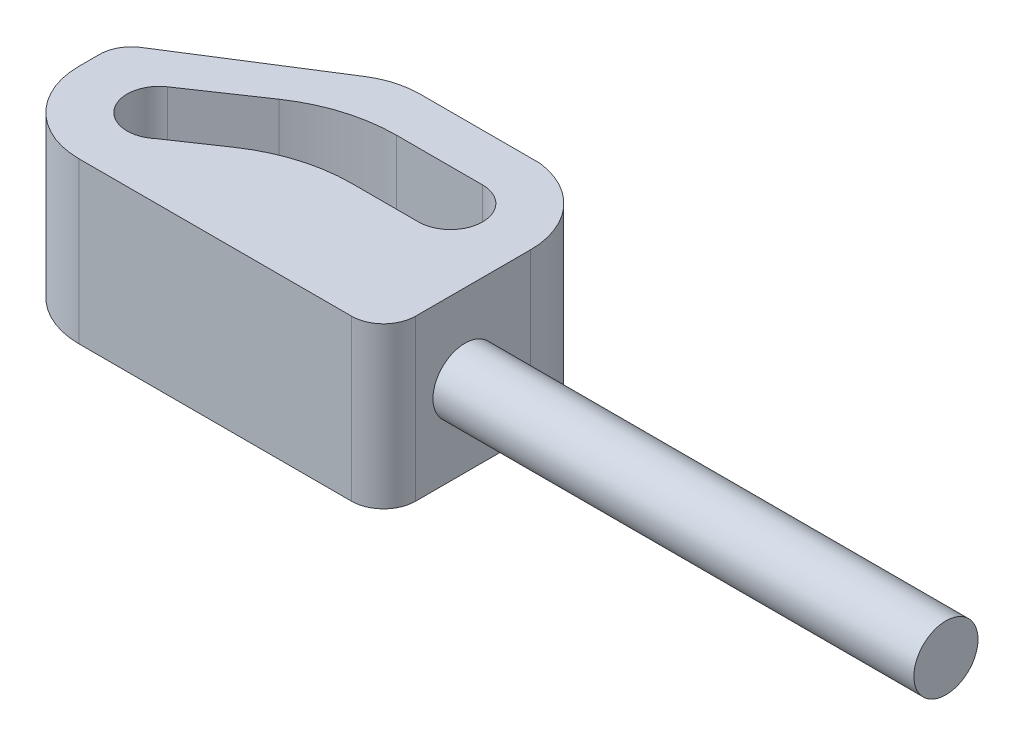
ISO-10303-21;
HEADER;
FILE_DESCRIPTION(('STEP AP214'),'2;1');
FILE_NAME('part.step','',(''),(''),'','','');
FILE_SCHEMA(('AUTOMOTIVE_DESIGN { 1 0 10303 214 1 1 1 1 }'));
ENDSEC;
DATA;
#1=APPLICATION_CONTEXT('core data for automotive mechanical design processes');
#2=APPLICATION_PROTOCOL_DEFINITION('international standard','automotive_design',2000,#1);
#3=PRODUCT_CONTEXT('',#1,'mechanical');
#4=PRODUCT('Part','Part','',(#3));
#5=PRODUCT_RELATED_PRODUCT_CATEGORY('part','',(#4));
#6=PRODUCT_DEFINITION_FORMATION('','',#4);
#7=PRODUCT_DEFINITION_CONTEXT('part definition',#1,'design');
#8=PRODUCT_DEFINITION('design','',#6,#7);
#9=PRODUCT_DEFINITION_SHAPE('','',#8);
#10=(LENGTH_UNIT() NAMED_UNIT(*) SI_UNIT(.MILLI.,.METRE.));
#11=(NAMED_UNIT(*) PLANE_ANGLE_UNIT() SI_UNIT($,.RADIAN.));
#12=(NAMED_UNIT(*) SI_UNIT($,.STERADIAN.) SOLID_ANGLE_UNIT());
#13=UNCERTAINTY_MEASURE_WITH_UNIT(LENGTH_MEASURE(1.E-05),#10,'distance_accuracy_value','');
#14=(GEOMETRIC_REPRESENTATION_CONTEXT(3) GLOBAL_UNCERTAINTY_ASSIGNED_CONTEXT((#13)) GLOBAL_UNIT_ASSIGNED_CONTEXT((#10,
#11,#12)) REPRESENTATION_CONTEXT('',''));
#15=CARTESIAN_POINT('',(0.,0.,0.));
#16=DIRECTION('',(0.,0.,1.));
#17=DIRECTION('',(1.,0.,0.));
#18=AXIS2_PLACEMENT_3D('',#15,#16,#17);
#19=CARTESIAN_POINT('',(14.084329858718,10.,7.91567014128203));
#20=DIRECTION('',(-1.,0.,0.));
#21=DIRECTION('',(0.,0.,1.));
#22=AXIS2_PLACEMENT_3D('',#19,#20,#21);
#23=PLANE('',#22);
#24=CARTESIAN_POINT('',(14.084329858718,5.,4.8338575747895));
#25=DIRECTION('',(-1.,0.,0.));
#26=DIRECTION('',(0.,0.,1.));
#27=AXIS2_PLACEMENT_3D('',#24,#25,#26);
#28=CIRCLE('',#27,2.);
#29=CARTESIAN_POINT('',(14.084329858718,5.,6.8338575747895));
#30=VERTEX_POINT('',#29);
#31=EDGE_CURVE('E12',#30,#30,#28,.F.);
#32=ORIENTED_EDGE('',*,*,#31,.F.);
#33=EDGE_LOOP('',(#32));
#34=FACE_BOUND('',#33,.T.);
#35=DIRECTION('',(0.,0.,-1.));
#36=VECTOR('',#35,1.);
#37=CARTESIAN_POINT('',(14.084329858718,0.,7.91567014128203));
#38=LINE('',#37,#36);
#39=CARTESIAN_POINT('',(14.084329858718,0.,7.91567014128203));
#40=VERTEX_POINT('',#39);
#41=CARTESIAN_POINT('',(14.084329858718,0.,0.738316599191666));
#42=VERTEX_POINT('',#41);
#43=EDGE_CURVE('E223',#40,#42,#38,.T.);
#44=ORIENTED_EDGE('',*,*,#43,.T.);
#45=DIRECTION('',(0.,-1.,0.));
#46=VECTOR('',#45,1.);
#47=CARTESIAN_POINT('',(14.084329858718,10.,0.738316599191666));
#48=LINE('',#47,#46);
#49=CARTESIAN_POINT('',(14.084329858718,10.,0.738316599191666));
#50=VERTEX_POINT('',#49);
#51=EDGE_CURVE('E97',#50,#42,#48,.T.);
#52=ORIENTED_EDGE('',*,*,#51,.F.);
#53=DIRECTION('',(0.,0.,-1.));
#54=VECTOR('',#53,1.);
#55=CARTESIAN_POINT('',(14.084329858718,10.,7.91567014128203));
#56=LINE('',#55,#54);
#57=CARTESIAN_POINT('',(14.084329858718,10.,7.91567014128203));
#58=VERTEX_POINT('',#57);
#59=EDGE_CURVE('E284',#58,#50,#56,.T.);
#60=ORIENTED_EDGE('',*,*,#59,.F.);
#61=DIRECTION('',(0.,-1.,0.));
#62=VECTOR('',#61,1.);
#63=CARTESIAN_POINT('',(14.084329858718,10.,7.91567014128203));
#64=LINE('',#63,#62);
#65=EDGE_CURVE('E307',#58,#40,#64,.T.);
#66=ORIENTED_EDGE('',*,*,#65,.T.);
#67=EDGE_LOOP('',(#44,#52,#60,#66));
#68=FACE_BOUND('',#67,.T.);
#69=ADVANCED_FACE('F90',(#34,#68),#23,.F.);
#70=CARTESIAN_POINT('',(9.08432985871795,10.,0.738316599191666));
#71=DIRECTION('',(0.,-1.,0.));
#72=DIRECTION('',(0.,0.,-1.));
#73=AXIS2_PLACEMENT_3D('',#70,#71,#72);
#74=CYLINDRICAL_SURFACE('',#73,5.);
#75=CARTESIAN_POINT('',(9.08432985871795,0.,0.738316599191666));
#76=DIRECTION('',(0.,1.,0.));
#77=DIRECTION('',(0.,0.,1.));
#78=AXIS2_PLACEMENT_3D('',#75,#76,#77);
#79=CIRCLE('',#78,5.);
#80=CARTESIAN_POINT('',(9.73028422272676,0.,-4.21978212507936));
#81=VERTEX_POINT('',#80);
#82=EDGE_CURVE('E310',#42,#81,#79,.T.);
#83=ORIENTED_EDGE('',*,*,#82,.T.);
#84=DIRECTION('',(0.,-1.,0.));
#85=VECTOR('',#84,1.);
#86=CARTESIAN_POINT('',(9.73028422272676,10.,-4.21978212507936));
#87=LINE('',#86,#85);
#88=CARTESIAN_POINT('',(9.73028422272676,10.,-4.21978212507936));
#89=VERTEX_POINT('',#88);
#90=EDGE_CURVE('E350',#89,#81,#87,.T.);
#91=ORIENTED_EDGE('',*,*,#90,.F.);
#92=CARTESIAN_POINT('',(9.08432985871795,10.,0.738316599191666));
#93=DIRECTION('',(0.,1.,0.));
#94=DIRECTION('',(0.,0.,1.));
#95=AXIS2_PLACEMENT_3D('',#92,#93,#94);
#96=CIRCLE('',#95,5.);
#97=EDGE_CURVE('E287',#50,#89,#96,.T.);
#98=ORIENTED_EDGE('',*,*,#97,.F.);
#99=ORIENTED_EDGE('',*,*,#51,.T.);
#100=EDGE_LOOP('',(#83,#91,#98,#99));
#101=FACE_BOUND('',#100,.T.);
#102=ADVANCED_FACE('F355',(#101),#74,.T.);
#103=CARTESIAN_POINT('',(9.73028422272676,10.,-4.21978212507936));
#104=DIRECTION('',(0.,0.,1.));
#105=DIRECTION('',(1.,0.,0.));
#106=AXIS2_PLACEMENT_3D('',#103,#104,#105);
#107=PLANE('',#106);
#108=DIRECTION('',(-1.,0.,0.));
#109=VECTOR('',#108,1.);
#110=CARTESIAN_POINT('',(9.73028422272676,0.,-4.21978212507936));
#111=LINE('',#110,#109);
#112=CARTESIAN_POINT('',(2.22436047137036,0.,-4.21978212507936));
#113=VERTEX_POINT('',#112);
#114=EDGE_CURVE('E312',#81,#113,#111,.T.);
#115=ORIENTED_EDGE('',*,*,#114,.T.);
#116=DIRECTION('',(0.,-1.,0.));
#117=VECTOR('',#116,1.);
#118=CARTESIAN_POINT('',(2.22436047137036,10.,-4.21978212507936));
#119=LINE('',#118,#117);
#120=CARTESIAN_POINT('',(2.22436047137036,10.,-4.21978212507936));
#121=VERTEX_POINT('',#120);
#122=EDGE_CURVE('E347',#121,#113,#119,.T.);
#123=ORIENTED_EDGE('',*,*,#122,.F.);
#124=DIRECTION('',(-1.,0.,0.));
#125=VECTOR('',#124,1.);
#126=CARTESIAN_POINT('',(9.73028422272676,10.,-4.21978212507936));
#127=LINE('',#126,#125);
#128=EDGE_CURVE('E290',#89,#121,#127,.T.);
#129=ORIENTED_EDGE('',*,*,#128,.F.);
#130=ORIENTED_EDGE('',*,*,#90,.T.);
#131=EDGE_LOOP('',(#115,#123,#129,#130));
#132=FACE_BOUND('',#131,.T.);
#133=ADVANCED_FACE('F370',(#132),#107,.F.);
#134=CARTESIAN_POINT('',(2.22436047137034,10.,0.780217874920642));
#135=DIRECTION('',(0.,-1.,0.));
#136=DIRECTION('',(0.,0.,-1.));
#137=AXIS2_PLACEMENT_3D('',#134,#135,#136);
#138=CYLINDRICAL_SURFACE('',#137,5.);
#139=CARTESIAN_POINT('',(2.22436047137034,0.,0.780217874920642));
#140=DIRECTION('',(0.,1.,0.));
#141=DIRECTION('',(0.,0.,1.));
#142=AXIS2_PLACEMENT_3D('',#139,#140,#141);
#143=CIRCLE('',#142,5.);
#144=CARTESIAN_POINT('',(-0.4483472573236,0.,-3.44549311815256));
#145=VERTEX_POINT('',#144);
#146=EDGE_CURVE('E314',#113,#145,#143,.T.);
#147=ORIENTED_EDGE('',*,*,#146,.T.);
#148=DIRECTION('',(0.,-1.,0.));
#149=VECTOR('',#148,1.);
#150=CARTESIAN_POINT('',(-0.4483472573236,10.,-3.44549311815256));
#151=LINE('',#150,#149);
#152=CARTESIAN_POINT('',(-0.4483472573236,10.,-3.44549311815256));
#153=VERTEX_POINT('',#152);
#154=EDGE_CURVE('E344',#153,#145,#151,.T.);
#155=ORIENTED_EDGE('',*,*,#154,.F.);
#156=CARTESIAN_POINT('',(2.22436047137034,10.,0.780217874920642));
#157=DIRECTION('',(0.,1.,0.));
#158=DIRECTION('',(0.,0.,1.));
#159=AXIS2_PLACEMENT_3D('',#156,#157,#158);
#160=CIRCLE('',#159,5.);
#161=EDGE_CURVE('E292',#121,#153,#160,.T.);
#162=ORIENTED_EDGE('',*,*,#161,.F.);
#163=ORIENTED_EDGE('',*,*,#122,.T.);
#164=EDGE_LOOP('',(#147,#155,#162,#163));
#165=FACE_BOUND('',#164,.T.);
#166=ADVANCED_FACE('F374',(#165),#138,.T.);
#167=CARTESIAN_POINT('',(-0.448347257323602,10.,-3.44549311815255));
#168=DIRECTION('',(0.534541545738786,0.,0.845142198614641));
#169=DIRECTION('',(0.845142198614641,0.,-0.534541545738786));
#170=AXIS2_PLACEMENT_3D('',#167,#168,#169);
#171=PLANE('',#170);
#172=DIRECTION('',(-0.845142198614641,0.,0.534541545738786));
#173=VECTOR('',#172,1.);
#174=CARTESIAN_POINT('',(-0.448347257323602,0.,-3.44549311815255));
#175=LINE('',#174,#173);
#176=CARTESIAN_POINT('',(-8.98475323275961,0.,1.95367361691659));
#177=VERTEX_POINT('',#176);
#178=EDGE_CURVE('E316',#145,#177,#175,.T.);
#179=ORIENTED_EDGE('',*,*,#178,.T.);
#180=DIRECTION('',(0.,-1.,0.));
#181=VECTOR('',#180,1.);
#182=CARTESIAN_POINT('',(-8.98475323275961,10.,1.95367361691659));
#183=LINE('',#182,#181);
#184=CARTESIAN_POINT('',(-8.98475323275961,10.,1.95367361691659));
#185=VERTEX_POINT('',#184);
#186=EDGE_CURVE('E341',#185,#177,#183,.T.);
#187=ORIENTED_EDGE('',*,*,#186,.F.);
#188=DIRECTION('',(-0.845142198614641,0.,0.534541545738786));
#189=VECTOR('',#188,1.);
#190=CARTESIAN_POINT('',(-0.448347257323602,10.,-3.44549311815255));
#191=LINE('',#190,#189);
#192=EDGE_CURVE('E294',#153,#185,#191,.T.);
#193=ORIENTED_EDGE('',*,*,#192,.F.);
#194=ORIENTED_EDGE('',*,*,#154,.T.);
#195=EDGE_LOOP('',(#179,#187,#193,#194));
#196=FACE_BOUND('',#195,.T.);
#197=ADVANCED_FACE('F399',(#196),#171,.F.);
#198=CARTESIAN_POINT('',(-7.91567014128205,10.,3.64395801414588));
#199=DIRECTION('',(0.,-1.,0.));
#200=DIRECTION('',(0.,0.,-1.));
#201=AXIS2_PLACEMENT_3D('',#198,#199,#200);
#202=CYLINDRICAL_SURFACE('',#201,2.);
#203=CARTESIAN_POINT('',(-7.91567014128205,0.,3.64395801414588));
#204=DIRECTION('',(0.,1.,0.));
#205=DIRECTION('',(0.,0.,1.));
#206=AXIS2_PLACEMENT_3D('',#203,#204,#205);
#207=CIRCLE('',#206,2.);
#208=CARTESIAN_POINT('',(-9.91567014128204,0.,3.64395801414588));
#209=VERTEX_POINT('',#208);
#210=EDGE_CURVE('E318',#177,#209,#207,.T.);
#211=ORIENTED_EDGE('',*,*,#210,.T.);
#212=DIRECTION('',(0.,-1.,0.));
#213=VECTOR('',#212,1.);
#214=CARTESIAN_POINT('',(-9.91567014128204,10.,3.64395801414588));
#215=LINE('',#214,#213);
#216=CARTESIAN_POINT('',(-9.91567014128204,10.,3.64395801414588));
#217=VERTEX_POINT('',#216);
#218=EDGE_CURVE('E339',#217,#209,#215,.T.);
#219=ORIENTED_EDGE('',*,*,#218,.F.);
#220=CARTESIAN_POINT('',(-7.91567014128205,10.,3.64395801414588));
#221=DIRECTION('',(0.,1.,0.));
#222=DIRECTION('',(0.,0.,1.));
#223=AXIS2_PLACEMENT_3D('',#220,#221,#222);
#224=CIRCLE('',#223,2.);
#225=EDGE_CURVE('E296',#185,#217,#224,.T.);
#226=ORIENTED_EDGE('',*,*,#225,.F.);
#227=ORIENTED_EDGE('',*,*,#186,.T.);
#228=EDGE_LOOP('',(#211,#219,#226,#227));
#229=FACE_BOUND('',#228,.T.);
#230=ADVANCED_FACE('F397',(#229),#202,.T.);
#231=CARTESIAN_POINT('',(-9.91567014128205,10.,4.91567014128205));
#232=DIRECTION('',(-1.,0.,0.));
#233=DIRECTION('',(0.,0.,1.));
#234=AXIS2_PLACEMENT_3D('',#231,#232,#233);
#235=PLANE('',#234);
#236=DIRECTION('',(0.,0.,-1.));
#237=VECTOR('',#236,1.);
#238=CARTESIAN_POINT('',(-9.91567014128205,0.,4.91567014128205));
#239=LINE('',#238,#237);
#240=CARTESIAN_POINT('',(-9.91567014128205,0.,4.91567014128205));
#241=VERTEX_POINT('',#240);
#242=EDGE_CURVE('E321',#241,#209,#239,.T.);
#243=ORIENTED_EDGE('',*,*,#242,.F.);
#244=DIRECTION('',(0.,-1.,0.));
#245=VECTOR('',#244,1.);
#246=CARTESIAN_POINT('',(-9.91567014128205,10.,4.91567014128205));
#247=LINE('',#246,#245);
#248=CARTESIAN_POINT('',(-9.91567014128205,10.,4.91567014128205));
#249=VERTEX_POINT('',#248);
#250=EDGE_CURVE('E337',#249,#241,#247,.T.);
#251=ORIENTED_EDGE('',*,*,#250,.F.);
#252=DIRECTION('',(0.,0.,-1.));
#253=VECTOR('',#252,1.);
#254=CARTESIAN_POINT('',(-9.91567014128205,10.,4.91567014128205));
#255=LINE('',#254,#253);
#256=EDGE_CURVE('E298',#249,#217,#255,.T.);
#257=ORIENTED_EDGE('',*,*,#256,.T.);
#258=ORIENTED_EDGE('',*,*,#218,.T.);
#259=EDGE_LOOP('',(#243,#251,#257,#258));
#260=FACE_BOUND('',#259,.T.);
#261=ADVANCED_FACE('F391',(#260),#235,.T.);
#262=CARTESIAN_POINT('',(-4.91567014128205,10.,4.91567014128205));
#263=DIRECTION('',(0.,-1.,0.));
#264=DIRECTION('',(0.,0.,-1.));
#265=AXIS2_PLACEMENT_3D('',#262,#263,#264);
#266=CYLINDRICAL_SURFACE('',#265,5.);
#267=CARTESIAN_POINT('',(-4.91567014128205,0.,4.91567014128205));
#268=DIRECTION('',(0.,1.,0.));
#269=DIRECTION('',(0.,0.,1.));
#270=AXIS2_PLACEMENT_3D('',#267,#268,#269);
#271=CIRCLE('',#270,5.);
#272=CARTESIAN_POINT('',(-4.91567014128205,0.,9.91567014128205));
#273=VERTEX_POINT('',#272);
#274=EDGE_CURVE('E324',#241,#273,#271,.T.);
#275=ORIENTED_EDGE('',*,*,#274,.T.);
#276=DIRECTION('',(0.,-1.,0.));
#277=VECTOR('',#276,1.);
#278=CARTESIAN_POINT('',(-4.91567014128205,10.,9.91567014128205));
#279=LINE('',#278,#277);
#280=CARTESIAN_POINT('',(-4.91567014128205,10.,9.91567014128205));
#281=VERTEX_POINT('',#280);
#282=EDGE_CURVE('E334',#281,#273,#279,.T.);
#283=ORIENTED_EDGE('',*,*,#282,.F.);
#284=CARTESIAN_POINT('',(-4.91567014128205,10.,4.91567014128205));
#285=DIRECTION('',(0.,1.,0.));
#286=DIRECTION('',(0.,0.,1.));
#287=AXIS2_PLACEMENT_3D('',#284,#285,#286);
#288=CIRCLE('',#287,5.);
#289=EDGE_CURVE('E301',#249,#281,#288,.T.);
#290=ORIENTED_EDGE('',*,*,#289,.F.);
#291=ORIENTED_EDGE('',*,*,#250,.T.);
#292=EDGE_LOOP('',(#275,#283,#290,#291));
#293=FACE_BOUND('',#292,.T.);
#294=ADVANCED_FACE('F400',(#293),#266,.T.);
#295=CARTESIAN_POINT('',(-4.91567014128205,10.,9.91567014128205));
#296=DIRECTION('',(0.,0.,-1.));
#297=DIRECTION('',(-1.,0.,0.));
#298=AXIS2_PLACEMENT_3D('',#295,#296,#297);
#299=PLANE('',#298);
#300=DIRECTION('',(1.,0.,0.));
#301=VECTOR('',#300,1.);
#302=CARTESIAN_POINT('',(-4.91567014128205,0.,9.91567014128205));
#303=LINE('',#302,#301);
#304=CARTESIAN_POINT('',(12.0843298587179,0.,9.91567014128205));
#305=VERTEX_POINT('',#304);
#306=EDGE_CURVE('E326',#273,#305,#303,.T.);
#307=ORIENTED_EDGE('',*,*,#306,.T.);
#308=DIRECTION('',(0.,-1.,0.));
#309=VECTOR('',#308,1.);
#310=CARTESIAN_POINT('',(12.0843298587179,10.,9.91567014128205));
#311=LINE('',#310,#309);
#312=CARTESIAN_POINT('',(12.0843298587179,10.,9.91567014128205));
#313=VERTEX_POINT('',#312);
#314=EDGE_CURVE('E331',#313,#305,#311,.T.);
#315=ORIENTED_EDGE('',*,*,#314,.F.);
#316=DIRECTION('',(1.,0.,0.));
#317=VECTOR('',#316,1.);
#318=CARTESIAN_POINT('',(-4.91567014128205,10.,9.91567014128205));
#319=LINE('',#318,#317);
#320=EDGE_CURVE('E303',#281,#313,#319,.T.);
#321=ORIENTED_EDGE('',*,*,#320,.F.);
#322=ORIENTED_EDGE('',*,*,#282,.T.);
#323=EDGE_LOOP('',(#307,#315,#321,#322));
#324=FACE_BOUND('',#323,.T.);
#325=ADVANCED_FACE('F384',(#324),#299,.F.);
#326=CARTESIAN_POINT('',(12.084329858718,10.,7.91567014128205));
#327=DIRECTION('',(0.,-1.,0.));
#328=DIRECTION('',(0.,0.,-1.));
#329=AXIS2_PLACEMENT_3D('',#326,#327,#328);
#330=CYLINDRICAL_SURFACE('',#329,2.);
#331=CARTESIAN_POINT('',(12.084329858718,0.,7.91567014128205));
#332=DIRECTION('',(0.,1.,0.));
#333=DIRECTION('',(0.,0.,1.));
#334=AXIS2_PLACEMENT_3D('',#331,#332,#333);
#335=CIRCLE('',#334,2.);
#336=EDGE_CURVE('E288',#305,#40,#335,.T.);
#337=ORIENTED_EDGE('',*,*,#336,.T.);
#338=ORIENTED_EDGE('',*,*,#65,.F.);
#339=CARTESIAN_POINT('',(12.084329858718,10.,7.91567014128205));
#340=DIRECTION('',(0.,1.,0.));
#341=DIRECTION('',(0.,0.,1.));
#342=AXIS2_PLACEMENT_3D('',#339,#340,#341);
#343=CIRCLE('',#342,2.);
#344=EDGE_CURVE('E305',#313,#58,#343,.T.);
#345=ORIENTED_EDGE('',*,*,#344,.F.);
#346=ORIENTED_EDGE('',*,*,#314,.T.);
#347=EDGE_LOOP('',(#337,#338,#345,#346));
#348=FACE_BOUND('',#347,.T.);
#349=ADVANCED_FACE('F382',(#348),#330,.T.);
#350=CARTESIAN_POINT('',(9.08432985871795,10.,0.738316599191666));
#351=DIRECTION('',(0.,1.,0.));
#352=DIRECTION('',(0.,0.,1.));
#353=AXIS2_PLACEMENT_3D('',#350,#351,#352);
#354=PLANE('',#353);
#355=CARTESIAN_POINT('',(3.70785032675634,10.,8.73831659919167));
#356=DIRECTION('',(0.,1.,0.));
#357=DIRECTION('',(0.,0.,1.));
#358=AXIS2_PLACEMENT_3D('',#355,#356,#357);
#359=CIRCLE('',#358,10.);
#360=CARTESIAN_POINT('',(-1.89843399280002,10.,0.457641739719377));
#361=VERTEX_POINT('',#360);
#362=CARTESIAN_POINT('',(3.70785032675634,10.,-1.26168340080833));
#363=VERTEX_POINT('',#362);
#364=EDGE_CURVE('E227',#361,#363,#359,.F.);
#365=ORIENTED_EDGE('',*,*,#364,.T.);
#366=DIRECTION('',(-1.,0.,0.));
#367=VECTOR('',#366,1.);
#368=CARTESIAN_POINT('',(0.,10.,-1.26168340080833));
#369=LINE('',#368,#367);
#370=CARTESIAN_POINT('',(9.08432985871795,10.,-1.26168340080833));
#371=VERTEX_POINT('',#370);
#372=EDGE_CURVE('E251',#371,#363,#369,.T.);
#373=ORIENTED_EDGE('',*,*,#372,.F.);
#374=CARTESIAN_POINT('',(9.08432985871795,10.,0.738316599191666));
#375=DIRECTION('',(0.,1.,0.));
#376=DIRECTION('',(0.,0.,1.));
#377=AXIS2_PLACEMENT_3D('',#374,#375,#376);
#378=CIRCLE('',#377,2.);
#379=CARTESIAN_POINT('',(9.08432985871795,10.,2.73831659919167));
#380=VERTEX_POINT('',#379);
#381=EDGE_CURVE('E249',#380,#371,#378,.T.);
#382=ORIENTED_EDGE('',*,*,#381,.F.);
#383=DIRECTION('',(-1.,0.,0.));
#384=VECTOR('',#383,1.);
#385=CARTESIAN_POINT('',(0.,10.,2.73831659919167));
#386=LINE('',#385,#384);
#387=CARTESIAN_POINT('',(4.90888820113521,10.,2.73831659919167));
#388=VERTEX_POINT('',#387);
#389=EDGE_CURVE('E246',#380,#388,#386,.T.);
#390=ORIENTED_EDGE('',*,*,#389,.T.);
#391=CARTESIAN_POINT('',(4.90888820113521,10.,12.7383165991917));
#392=DIRECTION('',(0.,1.,0.));
#393=DIRECTION('',(0.,0.,1.));
#394=AXIS2_PLACEMENT_3D('',#391,#392,#393);
#395=CIRCLE('',#394,10.);
#396=CARTESIAN_POINT('',(-0.697396118421155,10.,4.45764173971938));
#397=VERTEX_POINT('',#396);
#398=EDGE_CURVE('E244',#397,#388,#395,.F.);
#399=ORIENTED_EDGE('',*,*,#398,.F.);
#400=DIRECTION('',(-0.828067485947229,0.,0.560628431955636));
#401=VECTOR('',#400,1.);
#402=CARTESIAN_POINT('',(1.85021291531593,10.,2.73282814413877));
#403=LINE('',#402,#401);
#404=CARTESIAN_POINT('',(-3.60414551890359,10.,6.42560496268827));
#405=VERTEX_POINT('',#404);
#406=EDGE_CURVE('E239',#397,#405,#403,.T.);
#407=ORIENTED_EDGE('',*,*,#406,.T.);
#408=CARTESIAN_POINT('',(-4.91567014128205,10.,4.91567014128205));
#409=DIRECTION('',(0.,1.,0.));
#410=DIRECTION('',(0.,0.,1.));
#411=AXIS2_PLACEMENT_3D('',#408,#409,#410);
#412=CIRCLE('',#411,2.);
#413=CARTESIAN_POINT('',(-6.03692700519332,10.,3.25953516938759));
#414=VERTEX_POINT('',#413);
#415=EDGE_CURVE('E237',#414,#405,#412,.T.);
#416=ORIENTED_EDGE('',*,*,#415,.F.);
#417=DIRECTION('',(0.828067485947229,0.,-0.560628431955637));
#418=VECTOR('',#417,1.);
#419=CARTESIAN_POINT('',(-0.384231084261217,10.,-0.567522533341906));
#420=LINE('',#419,#418);
#421=EDGE_CURVE('E219',#414,#361,#420,.T.);
#422=ORIENTED_EDGE('',*,*,#421,.T.);
#423=EDGE_LOOP('',(#365,#373,#382,#390,#399,#407,#416,#422));
#424=FACE_BOUND('',#423,.T.);
#425=ORIENTED_EDGE('',*,*,#59,.T.);
#426=ORIENTED_EDGE('',*,*,#97,.T.);
#427=ORIENTED_EDGE('',*,*,#128,.T.);
#428=ORIENTED_EDGE('',*,*,#161,.T.);
#429=ORIENTED_EDGE('',*,*,#192,.T.);
#430=ORIENTED_EDGE('',*,*,#225,.T.);
#431=ORIENTED_EDGE('',*,*,#256,.F.);
#432=ORIENTED_EDGE('',*,*,#289,.T.);
#433=ORIENTED_EDGE('',*,*,#320,.T.);
#434=ORIENTED_EDGE('',*,*,#344,.T.);
#435=EDGE_LOOP('',(#425,#426,#427,#428,#429,#430,#431,#432,#433,#434));
#436=FACE_BOUND('',#435,.T.);
#437=ADVANCED_FACE('F234',(#424,#436),#354,.T.);
#438=CARTESIAN_POINT('',(9.08432985871795,0.,0.738316599191666));
#439=DIRECTION('',(0.,1.,0.));
#440=DIRECTION('',(0.,0.,1.));
#441=AXIS2_PLACEMENT_3D('',#438,#439,#440);
#442=PLANE('',#441);
#443=DIRECTION('',(-1.,0.,0.));
#444=VECTOR('',#443,1.);
#445=CARTESIAN_POINT('',(0.,0.,-1.26168340080833));
#446=LINE('',#445,#444);
#447=CARTESIAN_POINT('',(9.08432985871795,0.,-1.26168340080833));
#448=VERTEX_POINT('',#447);
#449=CARTESIAN_POINT('',(3.70785032675634,0.,-1.26168340080833));
#450=VERTEX_POINT('',#449);
#451=EDGE_CURVE('E232',#448,#450,#446,.T.);
#452=ORIENTED_EDGE('',*,*,#451,.T.);
#453=CARTESIAN_POINT('',(3.70785032675634,0.,8.73831659919167));
#454=DIRECTION('',(0.,1.,0.));
#455=DIRECTION('',(0.,0.,1.));
#456=AXIS2_PLACEMENT_3D('',#453,#454,#455);
#457=CIRCLE('',#456,10.);
#458=CARTESIAN_POINT('',(-1.89843399280002,0.,0.457641739719377));
#459=VERTEX_POINT('',#458);
#460=EDGE_CURVE('E112',#459,#450,#457,.F.);
#461=ORIENTED_EDGE('',*,*,#460,.F.);
#462=DIRECTION('',(0.828067485947229,0.,-0.560628431955637));
#463=VECTOR('',#462,1.);
#464=CARTESIAN_POINT('',(-0.384231084261217,0.,-0.567522533341906));
#465=LINE('',#464,#463);
#466=CARTESIAN_POINT('',(-6.03692700519332,0.,3.25953516938759));
#467=VERTEX_POINT('',#466);
#468=EDGE_CURVE('E222',#467,#459,#465,.T.);
#469=ORIENTED_EDGE('',*,*,#468,.F.);
#470=CARTESIAN_POINT('',(-4.91567014128205,0.,4.91567014128205));
#471=DIRECTION('',(0.,1.,0.));
#472=DIRECTION('',(0.,0.,1.));
#473=AXIS2_PLACEMENT_3D('',#470,#471,#472);
#474=CIRCLE('',#473,2.);
#475=CARTESIAN_POINT('',(-3.60414551890359,0.,6.42560496268827));
#476=VERTEX_POINT('',#475);
#477=EDGE_CURVE('E256',#467,#476,#474,.T.);
#478=ORIENTED_EDGE('',*,*,#477,.T.);
#479=DIRECTION('',(-0.828067485947229,0.,0.560628431955636));
#480=VECTOR('',#479,1.);
#481=CARTESIAN_POINT('',(1.85021291531593,0.,2.73282814413877));
#482=LINE('',#481,#480);
#483=CARTESIAN_POINT('',(-0.697396118421155,0.,4.45764173971938));
#484=VERTEX_POINT('',#483);
#485=EDGE_CURVE('E259',#484,#476,#482,.T.);
#486=ORIENTED_EDGE('',*,*,#485,.F.);
#487=CARTESIAN_POINT('',(4.90888820113521,0.,12.7383165991917));
#488=DIRECTION('',(0.,1.,0.));
#489=DIRECTION('',(0.,0.,1.));
#490=AXIS2_PLACEMENT_3D('',#487,#488,#489);
#491=CIRCLE('',#490,10.);
#492=CARTESIAN_POINT('',(4.90888820113521,0.,2.73831659919167));
#493=VERTEX_POINT('',#492);
#494=EDGE_CURVE('E262',#484,#493,#491,.F.);
#495=ORIENTED_EDGE('',*,*,#494,.T.);
#496=DIRECTION('',(-1.,0.,0.));
#497=VECTOR('',#496,1.);
#498=CARTESIAN_POINT('',(0.,0.,2.73831659919167));
#499=LINE('',#498,#497);
#500=CARTESIAN_POINT('',(9.08432985871795,0.,2.73831659919167));
#501=VERTEX_POINT('',#500);
#502=EDGE_CURVE('E265',#501,#493,#499,.T.);
#503=ORIENTED_EDGE('',*,*,#502,.F.);
#504=CARTESIAN_POINT('',(9.08432985871795,0.,0.738316599191666));
#505=DIRECTION('',(0.,1.,0.));
#506=DIRECTION('',(0.,0.,1.));
#507=AXIS2_PLACEMENT_3D('',#504,#505,#506);
#508=CIRCLE('',#507,2.);
#509=EDGE_CURVE('E268',#501,#448,#508,.T.);
#510=ORIENTED_EDGE('',*,*,#509,.T.);
#511=EDGE_LOOP('',(#452,#461,#469,#478,#486,#495,#503,#510));
#512=FACE_BOUND('',#511,.T.);
#513=ORIENTED_EDGE('',*,*,#43,.F.);
#514=ORIENTED_EDGE('',*,*,#336,.F.);
#515=ORIENTED_EDGE('',*,*,#306,.F.);
#516=ORIENTED_EDGE('',*,*,#274,.F.);
#517=ORIENTED_EDGE('',*,*,#242,.T.);
#518=ORIENTED_EDGE('',*,*,#210,.F.);
#519=ORIENTED_EDGE('',*,*,#178,.F.);
#520=ORIENTED_EDGE('',*,*,#146,.F.);
#521=ORIENTED_EDGE('',*,*,#114,.F.);
#522=ORIENTED_EDGE('',*,*,#82,.F.);
#523=EDGE_LOOP('',(#513,#514,#515,#516,#517,#518,#519,#520,#521,#522));
#524=FACE_BOUND('',#523,.T.);
#525=ADVANCED_FACE('F363',(#512,#524),#442,.F.);
#526=CARTESIAN_POINT('',(3.70785032675634,10.,8.73831659919167));
#527=DIRECTION('',(0.,-1.,0.));
#528=DIRECTION('',(0.,0.,-1.));
#529=AXIS2_PLACEMENT_3D('',#526,#527,#528);
#530=CYLINDRICAL_SURFACE('',#529,10.);
#531=ORIENTED_EDGE('',*,*,#460,.T.);
#532=DIRECTION('',(0.,-1.,0.));
#533=VECTOR('',#532,1.);
#534=CARTESIAN_POINT('',(3.70785032675634,10.,-1.26168340080833));
#535=LINE('',#534,#533);
#536=EDGE_CURVE('E229',#363,#450,#535,.T.);
#537=ORIENTED_EDGE('',*,*,#536,.F.);
#538=ORIENTED_EDGE('',*,*,#364,.F.);
#539=DIRECTION('',(0.,-1.,0.));
#540=VECTOR('',#539,1.);
#541=CARTESIAN_POINT('',(-1.89843399280002,10.,0.457641739719377));
#542=LINE('',#541,#540);
#543=EDGE_CURVE('E215',#361,#459,#542,.T.);
#544=ORIENTED_EDGE('',*,*,#543,.T.);
#545=EDGE_LOOP('',(#531,#537,#538,#544));
#546=FACE_BOUND('',#545,.T.);
#547=ADVANCED_FACE('F228',(#546),#530,.F.);
#548=CARTESIAN_POINT('',(-0.384231084261217,10.,-0.567522533341906));
#549=DIRECTION('',(-0.560628431955637,0.,-0.828067485947229));
#550=DIRECTION('',(-0.828067485947229,0.,0.560628431955637));
#551=AXIS2_PLACEMENT_3D('',#548,#549,#550);
#552=PLANE('',#551);
#553=ORIENTED_EDGE('',*,*,#468,.T.);
#554=ORIENTED_EDGE('',*,*,#543,.F.);
#555=ORIENTED_EDGE('',*,*,#421,.F.);
#556=DIRECTION('',(0.,-1.,0.));
#557=VECTOR('',#556,1.);
#558=CARTESIAN_POINT('',(-6.03692700519332,10.,3.25953516938759));
#559=LINE('',#558,#557);
#560=EDGE_CURVE('E224',#414,#467,#559,.T.);
#561=ORIENTED_EDGE('',*,*,#560,.T.);
#562=EDGE_LOOP('',(#553,#554,#555,#561));
#563=FACE_BOUND('',#562,.T.);
#564=ADVANCED_FACE('F217',(#563),#552,.F.);
#565=CARTESIAN_POINT('',(-4.91567014128205,10.,4.91567014128205));
#566=DIRECTION('',(0.,-1.,0.));
#567=DIRECTION('',(0.,0.,-1.));
#568=AXIS2_PLACEMENT_3D('',#565,#566,#567);
#569=CYLINDRICAL_SURFACE('',#568,2.);
#570=ORIENTED_EDGE('',*,*,#477,.F.);
#571=ORIENTED_EDGE('',*,*,#560,.F.);
#572=ORIENTED_EDGE('',*,*,#415,.T.);
#573=DIRECTION('',(0.,-1.,0.));
#574=VECTOR('',#573,1.);
#575=CARTESIAN_POINT('',(-3.60414551890359,10.,6.42560496268827));
#576=LINE('',#575,#574);
#577=EDGE_CURVE('E281',#405,#476,#576,.T.);
#578=ORIENTED_EDGE('',*,*,#577,.T.);
#579=EDGE_LOOP('',(#570,#571,#572,#578));
#580=FACE_BOUND('',#579,.T.);
#581=ADVANCED_FACE('F446',(#580),#569,.F.);
#582=CARTESIAN_POINT('',(1.85021291531593,10.,2.73282814413877));
#583=DIRECTION('',(0.560628431955636,0.,0.828067485947229));
#584=DIRECTION('',(0.828067485947229,0.,-0.560628431955636));
#585=AXIS2_PLACEMENT_3D('',#582,#583,#584);
#586=PLANE('',#585);
#587=ORIENTED_EDGE('',*,*,#485,.T.);
#588=ORIENTED_EDGE('',*,*,#577,.F.);
#589=ORIENTED_EDGE('',*,*,#406,.F.);
#590=DIRECTION('',(0.,-1.,0.));
#591=VECTOR('',#590,1.);
#592=CARTESIAN_POINT('',(-0.697396118421155,10.,4.45764173971938));
#593=LINE('',#592,#591);
#594=EDGE_CURVE('E279',#397,#484,#593,.T.);
#595=ORIENTED_EDGE('',*,*,#594,.T.);
#596=EDGE_LOOP('',(#587,#588,#589,#595));
#597=FACE_BOUND('',#596,.T.);
#598=ADVANCED_FACE('F442',(#597),#586,.F.);
#599=CARTESIAN_POINT('',(4.90888820113521,10.,12.7383165991917));
#600=DIRECTION('',(0.,-1.,0.));
#601=DIRECTION('',(0.,0.,-1.));
#602=AXIS2_PLACEMENT_3D('',#599,#600,#601);
#603=CYLINDRICAL_SURFACE('',#602,10.);
#604=ORIENTED_EDGE('',*,*,#494,.F.);
#605=ORIENTED_EDGE('',*,*,#594,.F.);
#606=ORIENTED_EDGE('',*,*,#398,.T.);
#607=DIRECTION('',(0.,-1.,0.));
#608=VECTOR('',#607,1.);
#609=CARTESIAN_POINT('',(4.90888820113521,10.,2.73831659919167));
#610=LINE('',#609,#608);
#611=EDGE_CURVE('E277',#388,#493,#610,.T.);
#612=ORIENTED_EDGE('',*,*,#611,.T.);
#613=EDGE_LOOP('',(#604,#605,#606,#612));
#614=FACE_BOUND('',#613,.T.);
#615=ADVANCED_FACE('F438',(#614),#603,.T.);
#616=CARTESIAN_POINT('',(0.,10.,2.73831659919167));
#617=DIRECTION('',(0.,0.,1.));
#618=DIRECTION('',(1.,0.,0.));
#619=AXIS2_PLACEMENT_3D('',#616,#617,#618);
#620=PLANE('',#619);
#621=ORIENTED_EDGE('',*,*,#502,.T.);
#622=ORIENTED_EDGE('',*,*,#611,.F.);
#623=ORIENTED_EDGE('',*,*,#389,.F.);
#624=DIRECTION('',(0.,-1.,0.));
#625=VECTOR('',#624,1.);
#626=CARTESIAN_POINT('',(9.08432985871795,10.,2.73831659919167));
#627=LINE('',#626,#625);
#628=EDGE_CURVE('E275',#380,#501,#627,.T.);
#629=ORIENTED_EDGE('',*,*,#628,.T.);
#630=EDGE_LOOP('',(#621,#622,#623,#629));
#631=FACE_BOUND('',#630,.T.);
#632=ADVANCED_FACE('F434',(#631),#620,.F.);
#633=CARTESIAN_POINT('',(9.08432985871795,10.,0.738316599191666));
#634=DIRECTION('',(0.,-1.,0.));
#635=DIRECTION('',(0.,0.,-1.));
#636=AXIS2_PLACEMENT_3D('',#633,#634,#635);
#637=CYLINDRICAL_SURFACE('',#636,2.);
#638=ORIENTED_EDGE('',*,*,#509,.F.);
#639=ORIENTED_EDGE('',*,*,#628,.F.);
#640=ORIENTED_EDGE('',*,*,#381,.T.);
#641=DIRECTION('',(0.,-1.,0.));
#642=VECTOR('',#641,1.);
#643=CARTESIAN_POINT('',(9.08432985871795,10.,-1.26168340080833));
#644=LINE('',#643,#642);
#645=EDGE_CURVE('E104',#371,#448,#644,.T.);
#646=ORIENTED_EDGE('',*,*,#645,.T.);
#647=EDGE_LOOP('',(#638,#639,#640,#646));
#648=FACE_BOUND('',#647,.T.);
#649=ADVANCED_FACE('F428',(#648),#637,.F.);
#650=CARTESIAN_POINT('',(0.,10.,-1.26168340080833));
#651=DIRECTION('',(0.,0.,1.));
#652=DIRECTION('',(1.,0.,0.));
#653=AXIS2_PLACEMENT_3D('',#650,#651,#652);
#654=PLANE('',#653);
#655=ORIENTED_EDGE('',*,*,#451,.F.);
#656=ORIENTED_EDGE('',*,*,#645,.F.);
#657=ORIENTED_EDGE('',*,*,#372,.T.);
#658=ORIENTED_EDGE('',*,*,#536,.T.);
#659=EDGE_LOOP('',(#655,#656,#657,#658));
#660=FACE_BOUND('',#659,.T.);
#661=ADVANCED_FACE('F419',(#660),#654,.T.);
#662=CARTESIAN_POINT('',(44.084329858718,5.,4.83385757478951));
#663=DIRECTION('',(-1.,0.,0.));
#664=DIRECTION('',(0.,0.,1.));
#665=AXIS2_PLACEMENT_3D('',#662,#663,#664);
#666=CYLINDRICAL_SURFACE('',#665,2.);
#667=CARTESIAN_POINT('',(44.084329858718,5.,4.83385757478951));
#668=DIRECTION('',(1.,0.,0.));
#669=DIRECTION('',(0.,0.,-1.));
#670=AXIS2_PLACEMENT_3D('',#667,#668,#669);
#671=CIRCLE('',#670,2.);
#672=CARTESIAN_POINT('',(44.084329858718,5.,2.83385757478951));
#673=VERTEX_POINT('',#672);
#674=EDGE_CURVE('E254',#673,#673,#671,.T.);
#675=ORIENTED_EDGE('',*,*,#674,.F.);
#676=EDGE_LOOP('',(#675));
#677=FACE_BOUND('',#676,.T.);
#678=ORIENTED_EDGE('',*,*,#31,.T.);
#679=EDGE_LOOP('',(#678));
#680=FACE_BOUND('',#679,.T.);
#681=ADVANCED_FACE('F416',(#677,#680),#666,.T.);
#682=CARTESIAN_POINT('',(44.084329858718,5.,4.83385757478951));
#683=DIRECTION('',(1.,0.,0.));
#684=DIRECTION('',(0.,0.,-1.));
#685=AXIS2_PLACEMENT_3D('',#682,#683,#684);
#686=PLANE('',#685);
#687=ORIENTED_EDGE('',*,*,#674,.T.);
#688=EDGE_LOOP('',(#687));
#689=FACE_BOUND('',#688,.T.);
#690=ADVANCED_FACE('F418',(#689),#686,.T.);
#691=CLOSED_SHELL('',(#69,#102,#133,#166,#197,#230,#261,#294,#325,#349,#437,#525,#547,#564,#581,
#598,#615,#632,#649,#661,#681,#690));
#692=MANIFOLD_SOLID_BREP('B2',#691);
#693=ADVANCED_BREP_SHAPE_REPRESENTATION('',(#18,#692),#14);
#694=SHAPE_DEFINITION_REPRESENTATION(#9,#693);
ENDSEC;
END-ISO-10303-21;
